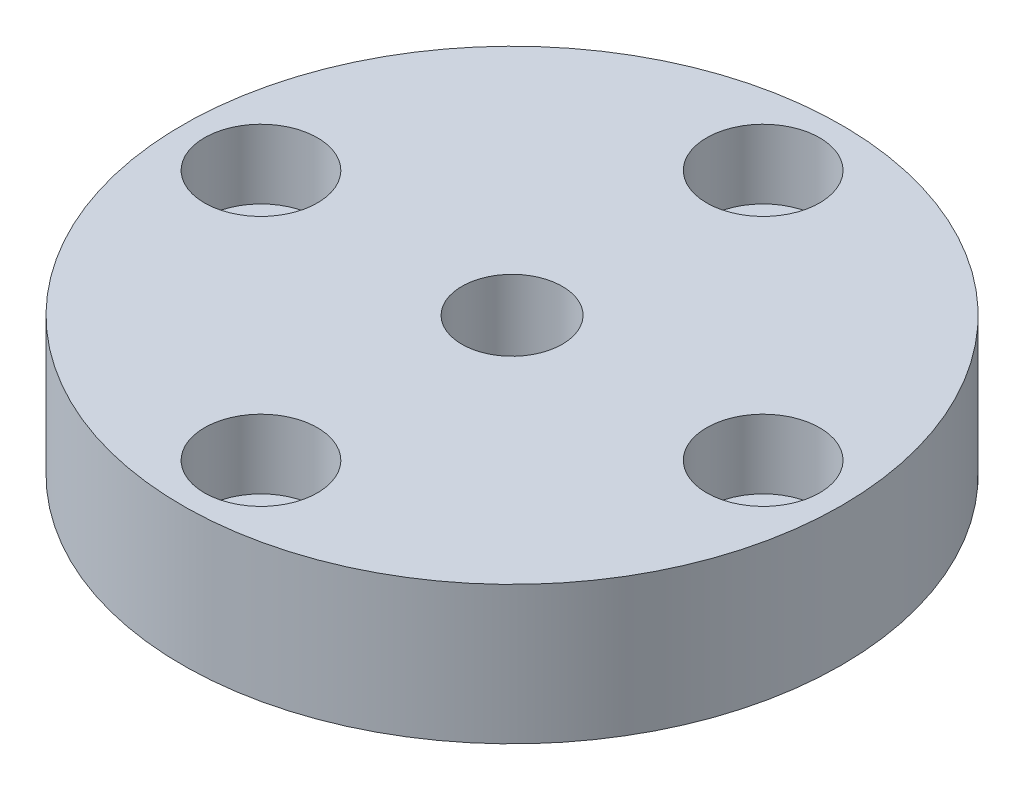
ISO-10303-21;
HEADER;
FILE_DESCRIPTION(('STEP AP214'),'2;1');
FILE_NAME('part.step','',(''),(''),'','','');
FILE_SCHEMA(('AUTOMOTIVE_DESIGN { 1 0 10303 214 1 1 1 1 }'));
ENDSEC;
DATA;
#1=APPLICATION_CONTEXT('core data for automotive mechanical design processes');
#2=APPLICATION_PROTOCOL_DEFINITION('international standard','automotive_design',2000,#1);
#3=PRODUCT_CONTEXT('',#1,'mechanical');
#4=PRODUCT('Part','Part','',(#3));
#5=PRODUCT_RELATED_PRODUCT_CATEGORY('part','',(#4));
#6=PRODUCT_DEFINITION_FORMATION('','',#4);
#7=PRODUCT_DEFINITION_CONTEXT('part definition',#1,'design');
#8=PRODUCT_DEFINITION('design','',#6,#7);
#9=PRODUCT_DEFINITION_SHAPE('','',#8);
#10=(LENGTH_UNIT() NAMED_UNIT(*) SI_UNIT(.MILLI.,.METRE.));
#11=(NAMED_UNIT(*) PLANE_ANGLE_UNIT() SI_UNIT($,.RADIAN.));
#12=(NAMED_UNIT(*) SI_UNIT($,.STERADIAN.) SOLID_ANGLE_UNIT());
#13=UNCERTAINTY_MEASURE_WITH_UNIT(LENGTH_MEASURE(1.E-05),#10,'distance_accuracy_value','');
#14=(GEOMETRIC_REPRESENTATION_CONTEXT(3) GLOBAL_UNCERTAINTY_ASSIGNED_CONTEXT((#13)) GLOBAL_UNIT_ASSIGNED_CONTEXT((#10,
#11,#12)) REPRESENTATION_CONTEXT('',''));
#15=CARTESIAN_POINT('',(0.,0.,0.));
#16=DIRECTION('',(0.,0.,1.));
#17=DIRECTION('',(1.,0.,0.));
#18=AXIS2_PLACEMENT_3D('',#15,#16,#17);
#19=CARTESIAN_POINT('',(25.,0.,0.));
#20=DIRECTION('',(0.,-1.,0.));
#21=DIRECTION('',(1.,0.,0.));
#22=AXIS2_PLACEMENT_3D('',#19,#20,#21);
#23=PLANE('',#22);
#24=CARTESIAN_POINT('',(0.,-1.11022302462516E-13,0.));
#25=DIRECTION('',(0.,-1.,0.));
#26=DIRECTION('',(1.,0.,0.));
#27=AXIS2_PLACEMENT_3D('',#24,#25,#26);
#28=CIRCLE('',#27,25.);
#29=CARTESIAN_POINT('',(25.,0.,0.));
#30=VERTEX_POINT('',#29);
#31=EDGE_CURVE('E63',#30,#30,#28,.T.);
#32=ORIENTED_EDGE('',*,*,#31,.T.);
#33=EDGE_LOOP('',(#32));
#34=FACE_BOUND('',#33,.T.);
#35=CARTESIAN_POINT('',(0.,0.,0.));
#36=DIRECTION('',(0.,-1.,0.));
#37=DIRECTION('',(1.,0.,0.));
#38=AXIS2_PLACEMENT_3D('',#35,#36,#37);
#39=CIRCLE('',#38,8.);
#40=CARTESIAN_POINT('',(8.,0.,0.));
#41=VERTEX_POINT('',#40);
#42=EDGE_CURVE('E10',#41,#41,#39,.T.);
#43=ORIENTED_EDGE('',*,*,#42,.F.);
#44=EDGE_LOOP('',(#43));
#45=FACE_BOUND('',#44,.T.);
#46=ADVANCED_FACE('F41',(#34,#45),#23,.T.);
#47=CARTESIAN_POINT('',(2.57586683167256E-12,-750.927070457355,0.));
#48=DIRECTION('',(0.,-1.,0.));
#49=DIRECTION('',(1.,0.,0.));
#50=AXIS2_PLACEMENT_3D('',#47,#48,#49);
#51=CYLINDRICAL_SURFACE('',#50,8.00000000000004);
#52=ORIENTED_EDGE('',*,*,#42,.T.);
#53=EDGE_LOOP('',(#52));
#54=FACE_BOUND('',#53,.T.);
#55=CARTESIAN_POINT('',(0.,27.,0.));
#56=DIRECTION('',(0.,-1.,0.));
#57=DIRECTION('',(1.,0.,0.));
#58=AXIS2_PLACEMENT_3D('',#55,#56,#57);
#59=CIRCLE('',#58,8.00000000000009);
#60=CARTESIAN_POINT('',(8.,27.0000000000001,0.));
#61=VERTEX_POINT('',#60);
#62=EDGE_CURVE('E49',#61,#61,#59,.T.);
#63=ORIENTED_EDGE('',*,*,#62,.F.);
#64=EDGE_LOOP('',(#63));
#65=FACE_BOUND('',#64,.T.);
#66=ADVANCED_FACE('F128',(#54,#65),#51,.F.);
#67=CARTESIAN_POINT('',(8.,26.9999999999999,0.));
#68=DIRECTION('',(0.,1.,0.));
#69=DIRECTION('',(-1.,0.,0.));
#70=AXIS2_PLACEMENT_3D('',#67,#68,#69);
#71=PLANE('',#70);
#72=CARTESIAN_POINT('',(-5.11594483631091E-13,26.9999999999999,40.));
#73=DIRECTION('',(0.,1.,0.));
#74=DIRECTION('',(0.,0.,1.));
#75=AXIS2_PLACEMENT_3D('',#72,#73,#74);
#76=CIRCLE('',#75,9.);
#77=CARTESIAN_POINT('',(-5.11594483631091E-13,26.9999999999999,49.));
#78=VERTEX_POINT('',#77);
#79=EDGE_CURVE('E209',#78,#78,#76,.T.);
#80=ORIENTED_EDGE('',*,*,#79,.F.);
#81=EDGE_LOOP('',(#80));
#82=FACE_BOUND('',#81,.T.);
#83=CARTESIAN_POINT('',(39.9999999999999,27.,0.));
#84=DIRECTION('',(0.,1.,0.));
#85=DIRECTION('',(0.,0.,1.));
#86=AXIS2_PLACEMENT_3D('',#83,#84,#85);
#87=CIRCLE('',#86,9.);
#88=CARTESIAN_POINT('',(39.9999999999999,27.,9.));
#89=VERTEX_POINT('',#88);
#90=EDGE_CURVE('E89',#89,#89,#87,.T.);
#91=ORIENTED_EDGE('',*,*,#90,.F.);
#92=EDGE_LOOP('',(#91));
#93=FACE_BOUND('',#92,.T.);
#94=CARTESIAN_POINT('',(0.,26.9999999999999,-40.));
#95=DIRECTION('',(0.,1.,0.));
#96=DIRECTION('',(0.,0.,1.));
#97=AXIS2_PLACEMENT_3D('',#94,#95,#96);
#98=CIRCLE('',#97,9.);
#99=CARTESIAN_POINT('',(0.,26.9999999999999,-31.));
#100=VERTEX_POINT('',#99);
#101=EDGE_CURVE('E73',#100,#100,#98,.T.);
#102=ORIENTED_EDGE('',*,*,#101,.F.);
#103=EDGE_LOOP('',(#102));
#104=FACE_BOUND('',#103,.T.);
#105=CARTESIAN_POINT('',(-40.0000000000001,26.9999999999998,0.));
#106=DIRECTION('',(0.,1.,0.));
#107=DIRECTION('',(0.,0.,1.));
#108=AXIS2_PLACEMENT_3D('',#105,#106,#107);
#109=CIRCLE('',#108,9.);
#110=CARTESIAN_POINT('',(-40.0000000000001,26.9999999999998,9.));
#111=VERTEX_POINT('',#110);
#112=EDGE_CURVE('E68',#111,#111,#109,.T.);
#113=ORIENTED_EDGE('',*,*,#112,.F.);
#114=EDGE_LOOP('',(#113));
#115=FACE_BOUND('',#114,.T.);
#116=ORIENTED_EDGE('',*,*,#62,.T.);
#117=EDGE_LOOP('',(#116));
#118=FACE_BOUND('',#117,.T.);
#119=CARTESIAN_POINT('',(0.,26.9999999999998,0.));
#120=DIRECTION('',(0.,-1.,0.));
#121=DIRECTION('',(1.,0.,0.));
#122=AXIS2_PLACEMENT_3D('',#119,#120,#121);
#123=CIRCLE('',#122,52.5000000000001);
#124=CARTESIAN_POINT('',(52.5,27.,0.));
#125=VERTEX_POINT('',#124);
#126=EDGE_CURVE('E55',#125,#125,#123,.T.);
#127=ORIENTED_EDGE('',*,*,#126,.F.);
#128=EDGE_LOOP('',(#127));
#129=FACE_BOUND('',#128,.T.);
#130=ADVANCED_FACE('F126',(#82,#93,#104,#115,#118,#129),#71,.T.);
#131=CARTESIAN_POINT('',(2.57586683167256E-12,-750.927070457355,0.));
#132=DIRECTION('',(0.,-1.,0.));
#133=DIRECTION('',(1.,0.,0.));
#134=AXIS2_PLACEMENT_3D('',#131,#132,#133);
#135=CYLINDRICAL_SURFACE('',#134,52.5000000000001);
#136=ORIENTED_EDGE('',*,*,#126,.T.);
#137=EDGE_LOOP('',(#136));
#138=FACE_BOUND('',#137,.T.);
#139=CARTESIAN_POINT('',(0.,4.99999999999978,0.));
#140=DIRECTION('',(0.,-1.,0.));
#141=DIRECTION('',(1.,0.,0.));
#142=AXIS2_PLACEMENT_3D('',#139,#140,#141);
#143=CIRCLE('',#142,52.5);
#144=CARTESIAN_POINT('',(52.5,4.99999999999996,0.));
#145=VERTEX_POINT('',#144);
#146=EDGE_CURVE('E116',#145,#145,#143,.T.);
#147=ORIENTED_EDGE('',*,*,#146,.F.);
#148=EDGE_LOOP('',(#147));
#149=FACE_BOUND('',#148,.T.);
#150=ADVANCED_FACE('F123',(#138,#149),#135,.T.);
#151=CARTESIAN_POINT('',(52.5,5.00000000000005,0.));
#152=DIRECTION('',(0.,-1.,0.));
#153=DIRECTION('',(1.,0.,0.));
#154=AXIS2_PLACEMENT_3D('',#151,#152,#153);
#155=PLANE('',#154);
#156=CARTESIAN_POINT('',(-5.11594483631091E-13,4.99999999999987,40.));
#157=DIRECTION('',(0.,-1.,0.));
#158=DIRECTION('',(1.,0.,0.));
#159=AXIS2_PLACEMENT_3D('',#156,#157,#158);
#160=CIRCLE('',#159,5.49999999999999);
#161=CARTESIAN_POINT('',(5.49999999999948,4.99999999999989,40.));
#162=VERTEX_POINT('',#161);
#163=EDGE_CURVE('E44',#162,#162,#160,.T.);
#164=ORIENTED_EDGE('',*,*,#163,.F.);
#165=EDGE_LOOP('',(#164));
#166=FACE_BOUND('',#165,.T.);
#167=CARTESIAN_POINT('',(39.9999999999999,5.00000000000001,0.));
#168=DIRECTION('',(0.,-1.,0.));
#169=DIRECTION('',(1.,0.,0.));
#170=AXIS2_PLACEMENT_3D('',#167,#168,#169);
#171=CIRCLE('',#170,5.49999999999999);
#172=CARTESIAN_POINT('',(45.4999999999999,5.00000000000003,0.));
#173=VERTEX_POINT('',#172);
#174=EDGE_CURVE('E70',#173,#173,#171,.T.);
#175=ORIENTED_EDGE('',*,*,#174,.F.);
#176=EDGE_LOOP('',(#175));
#177=FACE_BOUND('',#176,.T.);
#178=CARTESIAN_POINT('',(0.,4.99999999999987,-40.));
#179=DIRECTION('',(0.,-1.,0.));
#180=DIRECTION('',(1.,0.,0.));
#181=AXIS2_PLACEMENT_3D('',#178,#179,#180);
#182=CIRCLE('',#181,5.49999999999999);
#183=CARTESIAN_POINT('',(5.50000000000004,4.99999999999989,-40.));
#184=VERTEX_POINT('',#183);
#185=EDGE_CURVE('E65',#184,#184,#182,.T.);
#186=ORIENTED_EDGE('',*,*,#185,.F.);
#187=EDGE_LOOP('',(#186));
#188=FACE_BOUND('',#187,.T.);
#189=CARTESIAN_POINT('',(-40.0000000000001,4.99999999999973,0.));
#190=DIRECTION('',(0.,-1.,0.));
#191=DIRECTION('',(1.,0.,0.));
#192=AXIS2_PLACEMENT_3D('',#189,#190,#191);
#193=CIRCLE('',#192,5.49999999999999);
#194=CARTESIAN_POINT('',(-34.5000000000001,4.99999999999975,0.));
#195=VERTEX_POINT('',#194);
#196=EDGE_CURVE('E59',#195,#195,#193,.T.);
#197=ORIENTED_EDGE('',*,*,#196,.F.);
#198=EDGE_LOOP('',(#197));
#199=FACE_BOUND('',#198,.T.);
#200=ORIENTED_EDGE('',*,*,#146,.T.);
#201=EDGE_LOOP('',(#200));
#202=FACE_BOUND('',#201,.T.);
#203=CARTESIAN_POINT('',(0.,4.99999999999989,0.));
#204=DIRECTION('',(0.,-1.,0.));
#205=DIRECTION('',(1.,0.,0.));
#206=AXIS2_PLACEMENT_3D('',#203,#204,#205);
#207=CIRCLE('',#206,25.);
#208=CARTESIAN_POINT('',(25.,4.99999999999998,0.));
#209=VERTEX_POINT('',#208);
#210=EDGE_CURVE('E112',#209,#209,#207,.T.);
#211=ORIENTED_EDGE('',*,*,#210,.F.);
#212=EDGE_LOOP('',(#211));
#213=FACE_BOUND('',#212,.T.);
#214=ADVANCED_FACE('F135',(#166,#177,#188,#199,#202,#213),#155,.T.);
#215=CARTESIAN_POINT('',(2.57586683167256E-12,-750.927070457355,0.));
#216=DIRECTION('',(0.,-1.,0.));
#217=DIRECTION('',(1.,0.,0.));
#218=AXIS2_PLACEMENT_3D('',#215,#216,#217);
#219=CYLINDRICAL_SURFACE('',#218,25.);
#220=ORIENTED_EDGE('',*,*,#210,.T.);
#221=EDGE_LOOP('',(#220));
#222=FACE_BOUND('',#221,.T.);
#223=ORIENTED_EDGE('',*,*,#31,.F.);
#224=EDGE_LOOP('',(#223));
#225=FACE_BOUND('',#224,.T.);
#226=ADVANCED_FACE('F146',(#222,#225),#219,.T.);
#227=CARTESIAN_POINT('',(-40.0000000000001,26.9999999999998,0.));
#228=DIRECTION('',(0.,1.,0.));
#229=DIRECTION('',(0.,0.,1.));
#230=AXIS2_PLACEMENT_3D('',#227,#228,#229);
#231=CYLINDRICAL_SURFACE('',#230,5.49999999999999);
#232=ORIENTED_EDGE('',*,*,#196,.T.);
#233=EDGE_LOOP('',(#232));
#234=FACE_BOUND('',#233,.T.);
#235=CARTESIAN_POINT('',(-40.0000000000001,15.9999999999998,0.));
#236=DIRECTION('',(0.,1.,0.));
#237=DIRECTION('',(0.,0.,1.));
#238=AXIS2_PLACEMENT_3D('',#235,#236,#237);
#239=CIRCLE('',#238,5.5);
#240=CARTESIAN_POINT('',(-40.0000000000001,15.9999999999998,5.5));
#241=VERTEX_POINT('',#240);
#242=EDGE_CURVE('E64',#241,#241,#239,.T.);
#243=ORIENTED_EDGE('',*,*,#242,.T.);
#244=EDGE_LOOP('',(#243));
#245=FACE_BOUND('',#244,.T.);
#246=ADVANCED_FACE('F148',(#234,#245),#231,.F.);
#247=CARTESIAN_POINT('',(-34.5000000000001,15.9999999999998,0.));
#248=DIRECTION('',(0.,-1.,0.));
#249=DIRECTION('',(0.,0.,-1.));
#250=AXIS2_PLACEMENT_3D('',#247,#248,#249);
#251=PLANE('',#250);
#252=ORIENTED_EDGE('',*,*,#242,.F.);
#253=EDGE_LOOP('',(#252));
#254=FACE_BOUND('',#253,.T.);
#255=CARTESIAN_POINT('',(-40.0000000000001,15.9999999999998,0.));
#256=DIRECTION('',(0.,1.,0.));
#257=DIRECTION('',(0.,0.,1.));
#258=AXIS2_PLACEMENT_3D('',#255,#256,#257);
#259=CIRCLE('',#258,9.);
#260=CARTESIAN_POINT('',(-40.0000000000001,15.9999999999998,9.));
#261=VERTEX_POINT('',#260);
#262=EDGE_CURVE('E102',#261,#261,#259,.T.);
#263=ORIENTED_EDGE('',*,*,#262,.T.);
#264=EDGE_LOOP('',(#263));
#265=FACE_BOUND('',#264,.T.);
#266=ADVANCED_FACE('F155',(#254,#265),#251,.F.);
#267=CARTESIAN_POINT('',(-40.0000000000001,26.9999999999998,0.));
#268=DIRECTION('',(0.,1.,0.));
#269=DIRECTION('',(0.,0.,1.));
#270=AXIS2_PLACEMENT_3D('',#267,#268,#269);
#271=CYLINDRICAL_SURFACE('',#270,9.);
#272=ORIENTED_EDGE('',*,*,#262,.F.);
#273=EDGE_LOOP('',(#272));
#274=FACE_BOUND('',#273,.T.);
#275=ORIENTED_EDGE('',*,*,#112,.T.);
#276=EDGE_LOOP('',(#275));
#277=FACE_BOUND('',#276,.T.);
#278=ADVANCED_FACE('F163',(#274,#277),#271,.F.);
#279=CARTESIAN_POINT('',(0.,26.9999999999999,-40.));
#280=DIRECTION('',(0.,1.,0.));
#281=DIRECTION('',(0.,0.,1.));
#282=AXIS2_PLACEMENT_3D('',#279,#280,#281);
#283=CYLINDRICAL_SURFACE('',#282,5.49999999999999);
#284=ORIENTED_EDGE('',*,*,#185,.T.);
#285=EDGE_LOOP('',(#284));
#286=FACE_BOUND('',#285,.T.);
#287=CARTESIAN_POINT('',(0.,15.9999999999999,-40.));
#288=DIRECTION('',(0.,1.,0.));
#289=DIRECTION('',(0.,0.,1.));
#290=AXIS2_PLACEMENT_3D('',#287,#288,#289);
#291=CIRCLE('',#290,5.5);
#292=CARTESIAN_POINT('',(0.,15.9999999999999,-34.5));
#293=VERTEX_POINT('',#292);
#294=EDGE_CURVE('E69',#293,#293,#291,.T.);
#295=ORIENTED_EDGE('',*,*,#294,.T.);
#296=EDGE_LOOP('',(#295));
#297=FACE_BOUND('',#296,.T.);
#298=ADVANCED_FACE('F167',(#286,#297),#283,.F.);
#299=CARTESIAN_POINT('',(5.50000000000004,15.9999999999999,-40.));
#300=DIRECTION('',(0.,-1.,0.));
#301=DIRECTION('',(0.,0.,-1.));
#302=AXIS2_PLACEMENT_3D('',#299,#300,#301);
#303=PLANE('',#302);
#304=ORIENTED_EDGE('',*,*,#294,.F.);
#305=EDGE_LOOP('',(#304));
#306=FACE_BOUND('',#305,.T.);
#307=CARTESIAN_POINT('',(0.,15.9999999999999,-40.));
#308=DIRECTION('',(0.,1.,0.));
#309=DIRECTION('',(0.,0.,1.));
#310=AXIS2_PLACEMENT_3D('',#307,#308,#309);
#311=CIRCLE('',#310,9.);
#312=CARTESIAN_POINT('',(0.,15.9999999999999,-31.));
#313=VERTEX_POINT('',#312);
#314=EDGE_CURVE('E80',#313,#313,#311,.T.);
#315=ORIENTED_EDGE('',*,*,#314,.T.);
#316=EDGE_LOOP('',(#315));
#317=FACE_BOUND('',#316,.T.);
#318=ADVANCED_FACE('F171',(#306,#317),#303,.F.);
#319=CARTESIAN_POINT('',(0.,26.9999999999999,-40.));
#320=DIRECTION('',(0.,1.,0.));
#321=DIRECTION('',(0.,0.,1.));
#322=AXIS2_PLACEMENT_3D('',#319,#320,#321);
#323=CYLINDRICAL_SURFACE('',#322,9.);
#324=ORIENTED_EDGE('',*,*,#314,.F.);
#325=EDGE_LOOP('',(#324));
#326=FACE_BOUND('',#325,.T.);
#327=ORIENTED_EDGE('',*,*,#101,.T.);
#328=EDGE_LOOP('',(#327));
#329=FACE_BOUND('',#328,.T.);
#330=ADVANCED_FACE('F175',(#326,#329),#323,.F.);
#331=CARTESIAN_POINT('',(39.9999999999999,27.,0.));
#332=DIRECTION('',(0.,1.,0.));
#333=DIRECTION('',(0.,0.,1.));
#334=AXIS2_PLACEMENT_3D('',#331,#332,#333);
#335=CYLINDRICAL_SURFACE('',#334,5.49999999999999);
#336=ORIENTED_EDGE('',*,*,#174,.T.);
#337=EDGE_LOOP('',(#336));
#338=FACE_BOUND('',#337,.T.);
#339=CARTESIAN_POINT('',(39.9999999999999,16.,0.));
#340=DIRECTION('',(0.,1.,0.));
#341=DIRECTION('',(0.,0.,1.));
#342=AXIS2_PLACEMENT_3D('',#339,#340,#341);
#343=CIRCLE('',#342,5.5);
#344=CARTESIAN_POINT('',(39.9999999999999,16.,5.5));
#345=VERTEX_POINT('',#344);
#346=EDGE_CURVE('E74',#345,#345,#343,.T.);
#347=ORIENTED_EDGE('',*,*,#346,.T.);
#348=EDGE_LOOP('',(#347));
#349=FACE_BOUND('',#348,.T.);
#350=ADVANCED_FACE('F179',(#338,#349),#335,.F.);
#351=CARTESIAN_POINT('',(45.4999999999999,16.,0.));
#352=DIRECTION('',(0.,-1.,0.));
#353=DIRECTION('',(0.,0.,-1.));
#354=AXIS2_PLACEMENT_3D('',#351,#352,#353);
#355=PLANE('',#354);
#356=ORIENTED_EDGE('',*,*,#346,.F.);
#357=EDGE_LOOP('',(#356));
#358=FACE_BOUND('',#357,.T.);
#359=CARTESIAN_POINT('',(39.9999999999999,16.,0.));
#360=DIRECTION('',(0.,1.,0.));
#361=DIRECTION('',(0.,0.,1.));
#362=AXIS2_PLACEMENT_3D('',#359,#360,#361);
#363=CIRCLE('',#362,9.);
#364=CARTESIAN_POINT('',(39.9999999999999,16.,9.));
#365=VERTEX_POINT('',#364);
#366=EDGE_CURVE('E83',#365,#365,#363,.T.);
#367=ORIENTED_EDGE('',*,*,#366,.T.);
#368=EDGE_LOOP('',(#367));
#369=FACE_BOUND('',#368,.T.);
#370=ADVANCED_FACE('F183',(#358,#369),#355,.F.);
#371=CARTESIAN_POINT('',(39.9999999999999,27.,0.));
#372=DIRECTION('',(0.,1.,0.));
#373=DIRECTION('',(0.,0.,1.));
#374=AXIS2_PLACEMENT_3D('',#371,#372,#373);
#375=CYLINDRICAL_SURFACE('',#374,9.);
#376=ORIENTED_EDGE('',*,*,#366,.F.);
#377=EDGE_LOOP('',(#376));
#378=FACE_BOUND('',#377,.T.);
#379=ORIENTED_EDGE('',*,*,#90,.T.);
#380=EDGE_LOOP('',(#379));
#381=FACE_BOUND('',#380,.T.);
#382=ADVANCED_FACE('F186',(#378,#381),#375,.F.);
#383=CARTESIAN_POINT('',(-5.11594483631091E-13,26.9999999999999,40.));
#384=DIRECTION('',(0.,1.,0.));
#385=DIRECTION('',(0.,0.,1.));
#386=AXIS2_PLACEMENT_3D('',#383,#384,#385);
#387=CYLINDRICAL_SURFACE('',#386,5.49999999999999);
#388=ORIENTED_EDGE('',*,*,#163,.T.);
#389=EDGE_LOOP('',(#388));
#390=FACE_BOUND('',#389,.T.);
#391=CARTESIAN_POINT('',(-5.11594483631091E-13,15.9999999999999,40.));
#392=DIRECTION('',(0.,1.,0.));
#393=DIRECTION('',(0.,0.,1.));
#394=AXIS2_PLACEMENT_3D('',#391,#392,#393);
#395=CIRCLE('',#394,5.5);
#396=CARTESIAN_POINT('',(-5.11594483631091E-13,15.9999999999999,45.5));
#397=VERTEX_POINT('',#396);
#398=EDGE_CURVE('E213',#397,#397,#395,.T.);
#399=ORIENTED_EDGE('',*,*,#398,.T.);
#400=EDGE_LOOP('',(#399));
#401=FACE_BOUND('',#400,.T.);
#402=ADVANCED_FACE('F190',(#390,#401),#387,.F.);
#403=CARTESIAN_POINT('',(5.49999999999948,15.9999999999999,40.));
#404=DIRECTION('',(0.,-1.,0.));
#405=DIRECTION('',(0.,0.,-1.));
#406=AXIS2_PLACEMENT_3D('',#403,#404,#405);
#407=PLANE('',#406);
#408=ORIENTED_EDGE('',*,*,#398,.F.);
#409=EDGE_LOOP('',(#408));
#410=FACE_BOUND('',#409,.T.);
#411=CARTESIAN_POINT('',(-5.11594483631091E-13,15.9999999999999,40.));
#412=DIRECTION('',(0.,1.,0.));
#413=DIRECTION('',(0.,0.,1.));
#414=AXIS2_PLACEMENT_3D('',#411,#412,#413);
#415=CIRCLE('',#414,9.);
#416=CARTESIAN_POINT('',(-5.11594483631091E-13,15.9999999999999,49.));
#417=VERTEX_POINT('',#416);
#418=EDGE_CURVE('E207',#417,#417,#415,.T.);
#419=ORIENTED_EDGE('',*,*,#418,.T.);
#420=EDGE_LOOP('',(#419));
#421=FACE_BOUND('',#420,.T.);
#422=ADVANCED_FACE('F194',(#410,#421),#407,.F.);
#423=CARTESIAN_POINT('',(-5.11594483631091E-13,26.9999999999999,40.));
#424=DIRECTION('',(0.,1.,0.));
#425=DIRECTION('',(0.,0.,1.));
#426=AXIS2_PLACEMENT_3D('',#423,#424,#425);
#427=CYLINDRICAL_SURFACE('',#426,9.);
#428=ORIENTED_EDGE('',*,*,#418,.F.);
#429=EDGE_LOOP('',(#428));
#430=FACE_BOUND('',#429,.T.);
#431=ORIENTED_EDGE('',*,*,#79,.T.);
#432=EDGE_LOOP('',(#431));
#433=FACE_BOUND('',#432,.T.);
#434=ADVANCED_FACE('F198',(#430,#433),#427,.F.);
#435=CLOSED_SHELL('',(#46,#66,#130,#150,#214,#226,#246,#266,#278,#298,#318,#330,#350,#370,#382,
#402,#422,#434));
#436=MANIFOLD_SOLID_BREP('B2',#435);
#437=ADVANCED_BREP_SHAPE_REPRESENTATION('',(#18,#436),#14);
#438=SHAPE_DEFINITION_REPRESENTATION(#9,#437);
ENDSEC;
END-ISO-10303-21;
